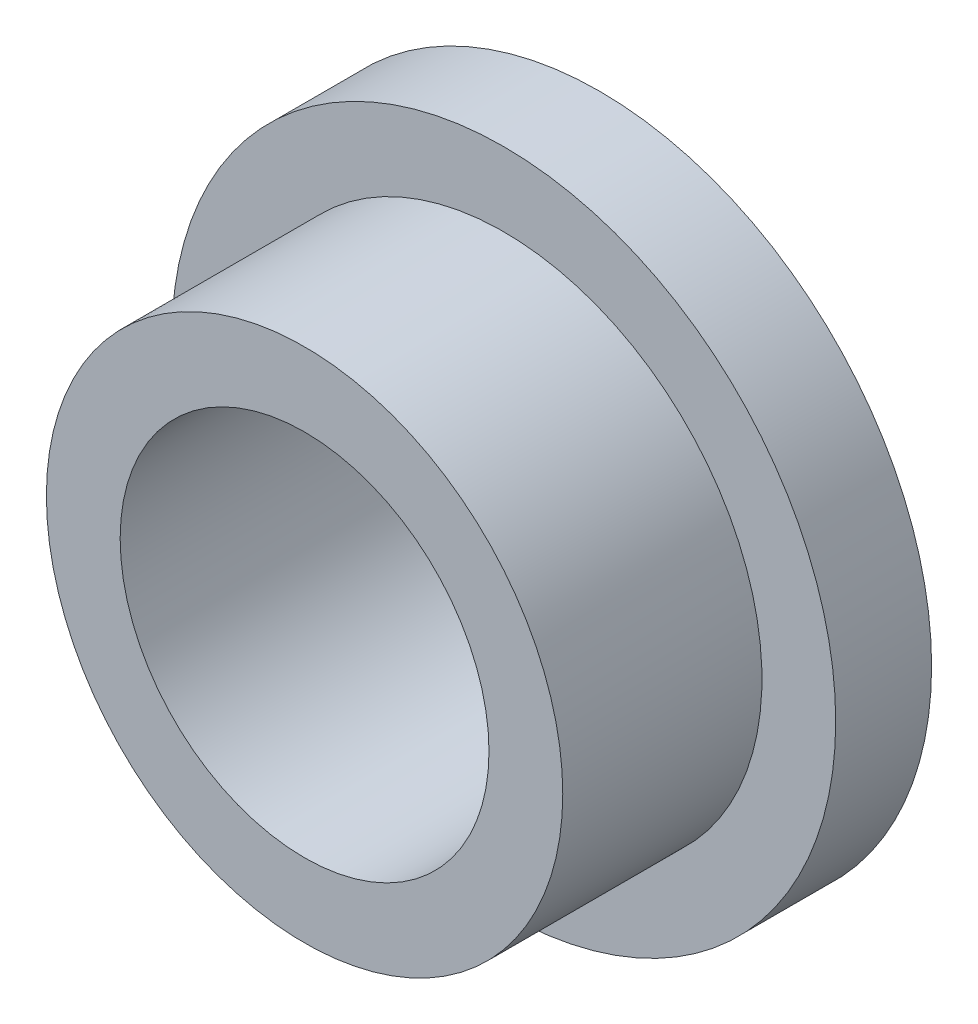
ISO-10303-21;
HEADER;
FILE_DESCRIPTION(('STEP AP214'),'2;1');
FILE_NAME('part.step','',(''),(''),'','','');
FILE_SCHEMA(('AUTOMOTIVE_DESIGN { 1 0 10303 214 1 1 1 1 }'));
ENDSEC;
DATA;
#1=APPLICATION_CONTEXT('core data for automotive mechanical design processes');
#2=APPLICATION_PROTOCOL_DEFINITION('international standard','automotive_design',2000,#1);
#3=PRODUCT_CONTEXT('',#1,'mechanical');
#4=PRODUCT('Part','Part','',(#3));
#5=PRODUCT_RELATED_PRODUCT_CATEGORY('part','',(#4));
#6=PRODUCT_DEFINITION_FORMATION('','',#4);
#7=PRODUCT_DEFINITION_CONTEXT('part definition',#1,'design');
#8=PRODUCT_DEFINITION('design','',#6,#7);
#9=PRODUCT_DEFINITION_SHAPE('','',#8);
#10=(LENGTH_UNIT() NAMED_UNIT(*) SI_UNIT(.MILLI.,.METRE.));
#11=(NAMED_UNIT(*) PLANE_ANGLE_UNIT() SI_UNIT($,.RADIAN.));
#12=(NAMED_UNIT(*) SI_UNIT($,.STERADIAN.) SOLID_ANGLE_UNIT());
#13=UNCERTAINTY_MEASURE_WITH_UNIT(LENGTH_MEASURE(1.E-05),#10,'distance_accuracy_value','');
#14=(GEOMETRIC_REPRESENTATION_CONTEXT(3) GLOBAL_UNCERTAINTY_ASSIGNED_CONTEXT((#13)) GLOBAL_UNIT_ASSIGNED_CONTEXT((#10,
#11,#12)) REPRESENTATION_CONTEXT('',''));
#15=CARTESIAN_POINT('',(0.,0.,0.));
#16=DIRECTION('',(0.,0.,1.));
#17=DIRECTION('',(1.,0.,0.));
#18=AXIS2_PLACEMENT_3D('',#15,#16,#17);
#19=CARTESIAN_POINT('',(0.,0.,12.));
#20=DIRECTION('',(0.,0.,-1.));
#21=DIRECTION('',(-1.,0.,0.));
#22=AXIS2_PLACEMENT_3D('',#19,#20,#21);
#23=CYLINDRICAL_SURFACE('',#22,10.5);
#24=CARTESIAN_POINT('',(0.,0.,12.));
#25=DIRECTION('',(0.,0.,1.));
#26=DIRECTION('',(1.,0.,0.));
#27=AXIS2_PLACEMENT_3D('',#24,#25,#26);
#28=CIRCLE('',#27,10.5);
#29=CARTESIAN_POINT('',(10.5,0.,12.));
#30=VERTEX_POINT('',#29);
#31=EDGE_CURVE('E57',#30,#30,#28,.T.);
#32=ORIENTED_EDGE('',*,*,#31,.F.);
#33=EDGE_LOOP('',(#32));
#34=FACE_BOUND('',#33,.T.);
#35=CARTESIAN_POINT('',(0.,0.,3.9));
#36=DIRECTION('',(0.,0.,-1.));
#37=DIRECTION('',(-1.,0.,0.));
#38=AXIS2_PLACEMENT_3D('',#35,#36,#37);
#39=CIRCLE('',#38,10.5);
#40=CARTESIAN_POINT('',(-10.5,0.,3.9));
#41=VERTEX_POINT('',#40);
#42=EDGE_CURVE('E11',#41,#41,#39,.T.);
#43=ORIENTED_EDGE('',*,*,#42,.F.);
#44=EDGE_LOOP('',(#43));
#45=FACE_BOUND('',#44,.T.);
#46=ADVANCED_FACE('F51',(#34,#45),#23,.T.);
#47=CARTESIAN_POINT('',(0.,0.,12.));
#48=DIRECTION('',(0.,0.,1.));
#49=DIRECTION('',(1.,0.,0.));
#50=AXIS2_PLACEMENT_3D('',#47,#48,#49);
#51=PLANE('',#50);
#52=ORIENTED_EDGE('',*,*,#31,.T.);
#53=EDGE_LOOP('',(#52));
#54=FACE_BOUND('',#53,.T.);
#55=CARTESIAN_POINT('',(0.,0.,12.));
#56=DIRECTION('',(0.,0.,1.));
#57=DIRECTION('',(1.,0.,0.));
#58=AXIS2_PLACEMENT_3D('',#55,#56,#57);
#59=CIRCLE('',#58,7.5);
#60=CARTESIAN_POINT('',(7.5,0.,12.));
#61=VERTEX_POINT('',#60);
#62=EDGE_CURVE('E61',#61,#61,#59,.T.);
#63=ORIENTED_EDGE('',*,*,#62,.F.);
#64=EDGE_LOOP('',(#63));
#65=FACE_BOUND('',#64,.T.);
#66=ADVANCED_FACE('F89',(#54,#65),#51,.T.);
#67=CARTESIAN_POINT('',(0.,0.,0.));
#68=DIRECTION('',(0.,0.,1.));
#69=DIRECTION('',(1.,0.,0.));
#70=AXIS2_PLACEMENT_3D('',#67,#68,#69);
#71=PLANE('',#70);
#72=CARTESIAN_POINT('',(0.,0.,0.));
#73=DIRECTION('',(0.,0.,1.));
#74=DIRECTION('',(1.,0.,0.));
#75=AXIS2_PLACEMENT_3D('',#72,#73,#74);
#76=CIRCLE('',#75,7.5);
#77=CARTESIAN_POINT('',(7.5,0.,0.));
#78=VERTEX_POINT('',#77);
#79=EDGE_CURVE('E65',#78,#78,#76,.T.);
#80=ORIENTED_EDGE('',*,*,#79,.T.);
#81=EDGE_LOOP('',(#80));
#82=FACE_BOUND('',#81,.T.);
#83=CARTESIAN_POINT('',(0.,0.,0.));
#84=DIRECTION('',(0.,0.,-1.));
#85=DIRECTION('',(-1.,0.,0.));
#86=AXIS2_PLACEMENT_3D('',#83,#84,#85);
#87=CIRCLE('',#86,13.5);
#88=CARTESIAN_POINT('',(-13.5,0.,0.));
#89=VERTEX_POINT('',#88);
#90=EDGE_CURVE('E71',#89,#89,#87,.T.);
#91=ORIENTED_EDGE('',*,*,#90,.T.);
#92=EDGE_LOOP('',(#91));
#93=FACE_BOUND('',#92,.T.);
#94=ADVANCED_FACE('F96',(#82,#93),#71,.F.);
#95=CARTESIAN_POINT('',(0.,0.,12.));
#96=DIRECTION('',(0.,0.,-1.));
#97=DIRECTION('',(-1.,0.,0.));
#98=AXIS2_PLACEMENT_3D('',#95,#96,#97);
#99=CYLINDRICAL_SURFACE('',#98,7.5);
#100=ORIENTED_EDGE('',*,*,#62,.T.);
#101=EDGE_LOOP('',(#100));
#102=FACE_BOUND('',#101,.T.);
#103=ORIENTED_EDGE('',*,*,#79,.F.);
#104=EDGE_LOOP('',(#103));
#105=FACE_BOUND('',#104,.T.);
#106=ADVANCED_FACE('F86',(#102,#105),#99,.F.);
#107=CARTESIAN_POINT('',(0.,0.,3.9));
#108=DIRECTION('',(0.,0.,-1.));
#109=DIRECTION('',(-1.,0.,0.));
#110=AXIS2_PLACEMENT_3D('',#107,#108,#109);
#111=CYLINDRICAL_SURFACE('',#110,13.5);
#112=CARTESIAN_POINT('',(0.,0.,3.9));
#113=DIRECTION('',(0.,0.,-1.));
#114=DIRECTION('',(-1.,0.,0.));
#115=AXIS2_PLACEMENT_3D('',#112,#113,#114);
#116=CIRCLE('',#115,13.5);
#117=CARTESIAN_POINT('',(-13.5,0.,3.9));
#118=VERTEX_POINT('',#117);
#119=EDGE_CURVE('E69',#118,#118,#116,.T.);
#120=ORIENTED_EDGE('',*,*,#119,.T.);
#121=EDGE_LOOP('',(#120));
#122=FACE_BOUND('',#121,.T.);
#123=ORIENTED_EDGE('',*,*,#90,.F.);
#124=EDGE_LOOP('',(#123));
#125=FACE_BOUND('',#124,.T.);
#126=ADVANCED_FACE('F77',(#122,#125),#111,.T.);
#127=CARTESIAN_POINT('',(0.,0.,3.9));
#128=DIRECTION('',(0.,0.,-1.));
#129=DIRECTION('',(-1.,0.,0.));
#130=AXIS2_PLACEMENT_3D('',#127,#128,#129);
#131=PLANE('',#130);
#132=ORIENTED_EDGE('',*,*,#42,.T.);
#133=EDGE_LOOP('',(#132));
#134=FACE_BOUND('',#133,.T.);
#135=ORIENTED_EDGE('',*,*,#119,.F.);
#136=EDGE_LOOP('',(#135));
#137=FACE_BOUND('',#136,.T.);
#138=ADVANCED_FACE('F80',(#134,#137),#131,.F.);
#139=CLOSED_SHELL('',(#46,#66,#94,#106,#126,#138));
#140=MANIFOLD_SOLID_BREP('B2',#139);
#141=ADVANCED_BREP_SHAPE_REPRESENTATION('',(#18,#140),#14);
#142=SHAPE_DEFINITION_REPRESENTATION(#9,#141);
ENDSEC;
END-ISO-10303-21;
